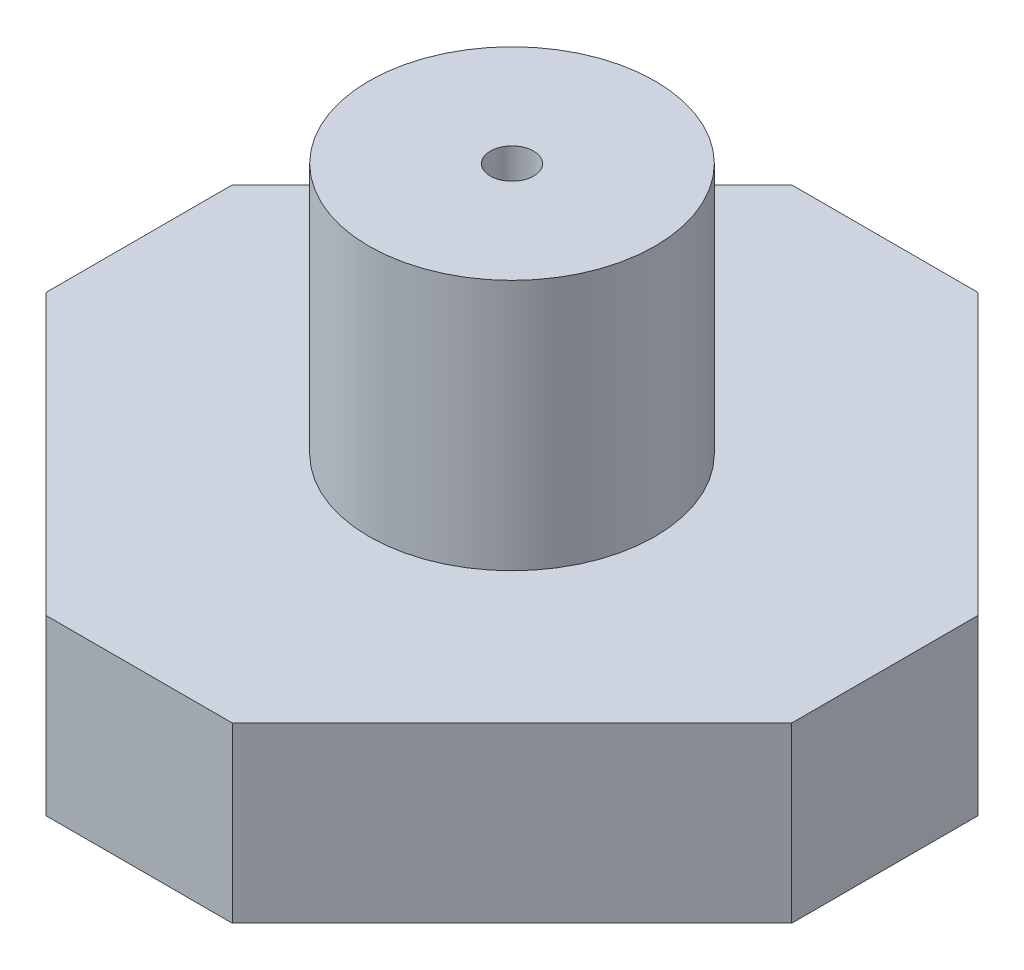
ISO-10303-21;
HEADER;
FILE_DESCRIPTION(('STEP AP214'),'2;1');
FILE_NAME('part.step','',(''),(''),'','','');
FILE_SCHEMA(('AUTOMOTIVE_DESIGN { 1 0 10303 214 1 1 1 1 }'));
ENDSEC;
DATA;
#1=APPLICATION_CONTEXT('core data for automotive mechanical design processes');
#2=APPLICATION_PROTOCOL_DEFINITION('international standard','automotive_design',2000,#1);
#3=PRODUCT_CONTEXT('',#1,'mechanical');
#4=PRODUCT('Part','Part','',(#3));
#5=PRODUCT_RELATED_PRODUCT_CATEGORY('part','',(#4));
#6=PRODUCT_DEFINITION_FORMATION('','',#4);
#7=PRODUCT_DEFINITION_CONTEXT('part definition',#1,'design');
#8=PRODUCT_DEFINITION('design','',#6,#7);
#9=PRODUCT_DEFINITION_SHAPE('','',#8);
#10=(LENGTH_UNIT() NAMED_UNIT(*) SI_UNIT(.MILLI.,.METRE.));
#11=(NAMED_UNIT(*) PLANE_ANGLE_UNIT() SI_UNIT($,.RADIAN.));
#12=(NAMED_UNIT(*) SI_UNIT($,.STERADIAN.) SOLID_ANGLE_UNIT());
#13=UNCERTAINTY_MEASURE_WITH_UNIT(LENGTH_MEASURE(1.E-05),#10,'distance_accuracy_value','');
#14=(GEOMETRIC_REPRESENTATION_CONTEXT(3) GLOBAL_UNCERTAINTY_ASSIGNED_CONTEXT((#13)) GLOBAL_UNIT_ASSIGNED_CONTEXT((#10,
#11,#12)) REPRESENTATION_CONTEXT('',''));
#15=CARTESIAN_POINT('',(0.,0.,0.));
#16=DIRECTION('',(0.,0.,1.));
#17=DIRECTION('',(1.,0.,0.));
#18=AXIS2_PLACEMENT_3D('',#15,#16,#17);
#19=CARTESIAN_POINT('',(-4.3,2.,-1.07401153701776));
#20=DIRECTION('',(1.,0.,0.));
#21=DIRECTION('',(0.,0.,-1.));
#22=AXIS2_PLACEMENT_3D('',#19,#20,#21);
#23=PLANE('',#22);
#24=DIRECTION('',(0.,0.,1.));
#25=VECTOR('',#24,1.);
#26=CARTESIAN_POINT('',(-4.3,0.,-1.07401153701776));
#27=LINE('',#26,#25);
#28=CARTESIAN_POINT('',(-4.3,0.,-1.07401153701776));
#29=VERTEX_POINT('',#28);
#30=CARTESIAN_POINT('',(-4.3,0.,1.07401153701776));
#31=VERTEX_POINT('',#30);
#32=EDGE_CURVE('E140',#29,#31,#27,.T.);
#33=ORIENTED_EDGE('',*,*,#32,.T.);
#34=DIRECTION('',(0.,-1.,0.));
#35=VECTOR('',#34,1.);
#36=CARTESIAN_POINT('',(-4.3,2.,1.07401153701776));
#37=LINE('',#36,#35);
#38=CARTESIAN_POINT('',(-4.3,2.,1.07401153701776));
#39=VERTEX_POINT('',#38);
#40=EDGE_CURVE('E50',#39,#31,#37,.T.);
#41=ORIENTED_EDGE('',*,*,#40,.F.);
#42=DIRECTION('',(0.,0.,1.));
#43=VECTOR('',#42,1.);
#44=CARTESIAN_POINT('',(-4.3,2.,-1.07401153701776));
#45=LINE('',#44,#43);
#46=CARTESIAN_POINT('',(-4.3,2.,-1.07401153701776));
#47=VERTEX_POINT('',#46);
#48=EDGE_CURVE('E155',#47,#39,#45,.T.);
#49=ORIENTED_EDGE('',*,*,#48,.F.);
#50=DIRECTION('',(0.,-1.,0.));
#51=VECTOR('',#50,1.);
#52=CARTESIAN_POINT('',(-4.3,2.,-1.07401153701776));
#53=LINE('',#52,#51);
#54=EDGE_CURVE('E136',#47,#29,#53,.T.);
#55=ORIENTED_EDGE('',*,*,#54,.T.);
#56=EDGE_LOOP('',(#33,#41,#49,#55));
#57=FACE_BOUND('',#56,.T.);
#58=ADVANCED_FACE('F41',(#57),#23,.F.);
#59=CARTESIAN_POINT('',(-4.3,2.,1.07401153701776));
#60=DIRECTION('',(0.707106781186548,0.,-0.707106781186547));
#61=DIRECTION('',(-0.707106781186547,0.,-0.707106781186548));
#62=AXIS2_PLACEMENT_3D('',#59,#60,#61);
#63=PLANE('',#62);
#64=DIRECTION('',(0.707106781186547,0.,0.707106781186548));
#65=VECTOR('',#64,1.);
#66=CARTESIAN_POINT('',(-4.3,0.,1.07401153701776));
#67=LINE('',#66,#65);
#68=CARTESIAN_POINT('',(-1.07401153701776,0.,4.3));
#69=VERTEX_POINT('',#68);
#70=EDGE_CURVE('E143',#31,#69,#67,.T.);
#71=ORIENTED_EDGE('',*,*,#70,.T.);
#72=DIRECTION('',(0.,-1.,0.));
#73=VECTOR('',#72,1.);
#74=CARTESIAN_POINT('',(-1.07401153701776,2.,4.3));
#75=LINE('',#74,#73);
#76=CARTESIAN_POINT('',(-1.07401153701776,2.,4.3));
#77=VERTEX_POINT('',#76);
#78=EDGE_CURVE('E165',#77,#69,#75,.T.);
#79=ORIENTED_EDGE('',*,*,#78,.F.);
#80=DIRECTION('',(0.707106781186547,0.,0.707106781186548));
#81=VECTOR('',#80,1.);
#82=CARTESIAN_POINT('',(-4.3,2.,1.07401153701776));
#83=LINE('',#82,#81);
#84=EDGE_CURVE('E103',#39,#77,#83,.T.);
#85=ORIENTED_EDGE('',*,*,#84,.F.);
#86=ORIENTED_EDGE('',*,*,#40,.T.);
#87=EDGE_LOOP('',(#71,#79,#85,#86));
#88=FACE_BOUND('',#87,.T.);
#89=ADVANCED_FACE('F168',(#88),#63,.F.);
#90=CARTESIAN_POINT('',(-1.07401153701776,2.,4.3));
#91=DIRECTION('',(0.,0.,-1.));
#92=DIRECTION('',(-1.,0.,0.));
#93=AXIS2_PLACEMENT_3D('',#90,#91,#92);
#94=PLANE('',#93);
#95=DIRECTION('',(1.,0.,0.));
#96=VECTOR('',#95,1.);
#97=CARTESIAN_POINT('',(-1.07401153701776,0.,4.3));
#98=LINE('',#97,#96);
#99=CARTESIAN_POINT('',(1.07401153701776,0.,4.3));
#100=VERTEX_POINT('',#99);
#101=EDGE_CURVE('E146',#69,#100,#98,.T.);
#102=ORIENTED_EDGE('',*,*,#101,.T.);
#103=DIRECTION('',(0.,-1.,0.));
#104=VECTOR('',#103,1.);
#105=CARTESIAN_POINT('',(1.07401153701776,2.,4.3));
#106=LINE('',#105,#104);
#107=CARTESIAN_POINT('',(1.07401153701776,2.,4.3));
#108=VERTEX_POINT('',#107);
#109=EDGE_CURVE('E162',#108,#100,#106,.T.);
#110=ORIENTED_EDGE('',*,*,#109,.F.);
#111=DIRECTION('',(1.,0.,0.));
#112=VECTOR('',#111,1.);
#113=CARTESIAN_POINT('',(-1.07401153701776,2.,4.3));
#114=LINE('',#113,#112);
#115=EDGE_CURVE('E186',#77,#108,#114,.T.);
#116=ORIENTED_EDGE('',*,*,#115,.F.);
#117=ORIENTED_EDGE('',*,*,#78,.T.);
#118=EDGE_LOOP('',(#102,#110,#116,#117));
#119=FACE_BOUND('',#118,.T.);
#120=ADVANCED_FACE('F179',(#119),#94,.F.);
#121=CARTESIAN_POINT('',(1.07401153701776,2.,4.3));
#122=DIRECTION('',(-0.707106781186548,0.,-0.707106781186547));
#123=DIRECTION('',(-0.707106781186547,0.,0.707106781186548));
#124=AXIS2_PLACEMENT_3D('',#121,#122,#123);
#125=PLANE('',#124);
#126=DIRECTION('',(0.707106781186547,0.,-0.707106781186548));
#127=VECTOR('',#126,1.);
#128=CARTESIAN_POINT('',(1.07401153701776,0.,4.3));
#129=LINE('',#128,#127);
#130=CARTESIAN_POINT('',(4.3,0.,1.07401153701776));
#131=VERTEX_POINT('',#130);
#132=EDGE_CURVE('E148',#100,#131,#129,.T.);
#133=ORIENTED_EDGE('',*,*,#132,.T.);
#134=DIRECTION('',(0.,-1.,0.));
#135=VECTOR('',#134,1.);
#136=CARTESIAN_POINT('',(4.3,2.,1.07401153701776));
#137=LINE('',#136,#135);
#138=CARTESIAN_POINT('',(4.3,2.,1.07401153701776));
#139=VERTEX_POINT('',#138);
#140=EDGE_CURVE('E159',#139,#131,#137,.T.);
#141=ORIENTED_EDGE('',*,*,#140,.F.);
#142=DIRECTION('',(0.707106781186547,0.,-0.707106781186548));
#143=VECTOR('',#142,1.);
#144=CARTESIAN_POINT('',(1.07401153701776,2.,4.3));
#145=LINE('',#144,#143);
#146=EDGE_CURVE('E185',#108,#139,#145,.T.);
#147=ORIENTED_EDGE('',*,*,#146,.F.);
#148=ORIENTED_EDGE('',*,*,#109,.T.);
#149=EDGE_LOOP('',(#133,#141,#147,#148));
#150=FACE_BOUND('',#149,.T.);
#151=ADVANCED_FACE('F183',(#150),#125,.F.);
#152=CARTESIAN_POINT('',(4.3,2.,-1.07401153701776));
#153=DIRECTION('',(-1.,0.,0.));
#154=DIRECTION('',(0.,0.,1.));
#155=AXIS2_PLACEMENT_3D('',#152,#153,#154);
#156=PLANE('',#155);
#157=DIRECTION('',(0.,0.,-1.));
#158=VECTOR('',#157,1.);
#159=CARTESIAN_POINT('',(4.3,0.,-1.07401153701776));
#160=LINE('',#159,#158);
#161=CARTESIAN_POINT('',(4.3,0.,-1.07401153701776));
#162=VERTEX_POINT('',#161);
#163=EDGE_CURVE('E150',#131,#162,#160,.T.);
#164=ORIENTED_EDGE('',*,*,#163,.T.);
#165=DIRECTION('',(0.,-1.,0.));
#166=VECTOR('',#165,1.);
#167=CARTESIAN_POINT('',(4.3,2.,-1.07401153701776));
#168=LINE('',#167,#166);
#169=CARTESIAN_POINT('',(4.3,2.,-1.07401153701776));
#170=VERTEX_POINT('',#169);
#171=EDGE_CURVE('E131',#170,#162,#168,.T.);
#172=ORIENTED_EDGE('',*,*,#171,.F.);
#173=DIRECTION('',(0.,0.,-1.));
#174=VECTOR('',#173,1.);
#175=CARTESIAN_POINT('',(4.3,2.,-1.07401153701776));
#176=LINE('',#175,#174);
#177=EDGE_CURVE('E122',#139,#170,#176,.T.);
#178=ORIENTED_EDGE('',*,*,#177,.F.);
#179=ORIENTED_EDGE('',*,*,#140,.T.);
#180=EDGE_LOOP('',(#164,#172,#178,#179));
#181=FACE_BOUND('',#180,.T.);
#182=ADVANCED_FACE('F236',(#181),#156,.F.);
#183=CARTESIAN_POINT('',(1.07401153701776,2.,-4.3));
#184=DIRECTION('',(-0.707106781186547,0.,0.707106781186548));
#185=DIRECTION('',(0.707106781186548,0.,0.707106781186547));
#186=AXIS2_PLACEMENT_3D('',#183,#184,#185);
#187=PLANE('',#186);
#188=DIRECTION('',(-0.707106781186548,0.,-0.707106781186547));
#189=VECTOR('',#188,1.);
#190=CARTESIAN_POINT('',(1.07401153701776,0.,-4.3));
#191=LINE('',#190,#189);
#192=CARTESIAN_POINT('',(1.07401153701776,0.,-4.3));
#193=VERTEX_POINT('',#192);
#194=EDGE_CURVE('E130',#162,#193,#191,.T.);
#195=ORIENTED_EDGE('',*,*,#194,.T.);
#196=DIRECTION('',(0.,-1.,0.));
#197=VECTOR('',#196,1.);
#198=CARTESIAN_POINT('',(1.07401153701776,2.,-4.3));
#199=LINE('',#198,#197);
#200=CARTESIAN_POINT('',(1.07401153701776,2.,-4.3));
#201=VERTEX_POINT('',#200);
#202=EDGE_CURVE('E127',#201,#193,#199,.T.);
#203=ORIENTED_EDGE('',*,*,#202,.F.);
#204=DIRECTION('',(-0.707106781186548,0.,-0.707106781186547));
#205=VECTOR('',#204,1.);
#206=CARTESIAN_POINT('',(1.07401153701776,2.,-4.3));
#207=LINE('',#206,#205);
#208=EDGE_CURVE('E116',#170,#201,#207,.T.);
#209=ORIENTED_EDGE('',*,*,#208,.F.);
#210=ORIENTED_EDGE('',*,*,#171,.T.);
#211=EDGE_LOOP('',(#195,#203,#209,#210));
#212=FACE_BOUND('',#211,.T.);
#213=ADVANCED_FACE('F128',(#212),#187,.F.);
#214=CARTESIAN_POINT('',(-1.07401153701776,2.,-4.3));
#215=DIRECTION('',(0.,0.,1.));
#216=DIRECTION('',(1.,0.,0.));
#217=AXIS2_PLACEMENT_3D('',#214,#215,#216);
#218=PLANE('',#217);
#219=DIRECTION('',(-1.,0.,0.));
#220=VECTOR('',#219,1.);
#221=CARTESIAN_POINT('',(-1.07401153701776,0.,-4.3));
#222=LINE('',#221,#220);
#223=CARTESIAN_POINT('',(-1.07401153701776,0.,-4.3));
#224=VERTEX_POINT('',#223);
#225=EDGE_CURVE('E88',#193,#224,#222,.T.);
#226=ORIENTED_EDGE('',*,*,#225,.T.);
#227=DIRECTION('',(0.,-1.,0.));
#228=VECTOR('',#227,1.);
#229=CARTESIAN_POINT('',(-1.07401153701776,2.,-4.3));
#230=LINE('',#229,#228);
#231=CARTESIAN_POINT('',(-1.07401153701776,2.,-4.3));
#232=VERTEX_POINT('',#231);
#233=EDGE_CURVE('E132',#232,#224,#230,.T.);
#234=ORIENTED_EDGE('',*,*,#233,.F.);
#235=DIRECTION('',(-1.,0.,0.));
#236=VECTOR('',#235,1.);
#237=CARTESIAN_POINT('',(-1.07401153701776,2.,-4.3));
#238=LINE('',#237,#236);
#239=EDGE_CURVE('E120',#201,#232,#238,.T.);
#240=ORIENTED_EDGE('',*,*,#239,.F.);
#241=ORIENTED_EDGE('',*,*,#202,.T.);
#242=EDGE_LOOP('',(#226,#234,#240,#241));
#243=FACE_BOUND('',#242,.T.);
#244=ADVANCED_FACE('F134',(#243),#218,.F.);
#245=CARTESIAN_POINT('',(-4.3,2.,-1.07401153701776));
#246=DIRECTION('',(0.707106781186547,0.,0.707106781186547));
#247=DIRECTION('',(0.707106781186548,0.,-0.707106781186548));
#248=AXIS2_PLACEMENT_3D('',#245,#246,#247);
#249=PLANE('',#248);
#250=DIRECTION('',(-0.707106781186548,0.,0.707106781186548));
#251=VECTOR('',#250,1.);
#252=CARTESIAN_POINT('',(-4.3,0.,-1.07401153701776));
#253=LINE('',#252,#251);
#254=EDGE_CURVE('E94',#224,#29,#253,.T.);
#255=ORIENTED_EDGE('',*,*,#254,.T.);
#256=ORIENTED_EDGE('',*,*,#54,.F.);
#257=DIRECTION('',(-0.707106781186548,0.,0.707106781186548));
#258=VECTOR('',#257,1.);
#259=CARTESIAN_POINT('',(-4.3,2.,-1.07401153701776));
#260=LINE('',#259,#258);
#261=EDGE_CURVE('E59',#232,#47,#260,.T.);
#262=ORIENTED_EDGE('',*,*,#261,.F.);
#263=ORIENTED_EDGE('',*,*,#233,.T.);
#264=EDGE_LOOP('',(#255,#256,#262,#263));
#265=FACE_BOUND('',#264,.T.);
#266=ADVANCED_FACE('F216',(#265),#249,.F.);
#267=CARTESIAN_POINT('',(0.,2.,0.));
#268=DIRECTION('',(0.,1.,0.));
#269=DIRECTION('',(0.,0.,1.));
#270=AXIS2_PLACEMENT_3D('',#267,#268,#269);
#271=PLANE('',#270);
#272=CARTESIAN_POINT('',(0.,2.,0.));
#273=DIRECTION('',(0.,1.,0.));
#274=DIRECTION('',(0.,0.,1.));
#275=AXIS2_PLACEMENT_3D('',#272,#273,#274);
#276=CIRCLE('',#275,1.65);
#277=CARTESIAN_POINT('',(0.,2.,1.65));
#278=VERTEX_POINT('',#277);
#279=EDGE_CURVE('E11',#278,#278,#276,.T.);
#280=ORIENTED_EDGE('',*,*,#279,.F.);
#281=EDGE_LOOP('',(#280));
#282=FACE_BOUND('',#281,.T.);
#283=ORIENTED_EDGE('',*,*,#48,.T.);
#284=ORIENTED_EDGE('',*,*,#84,.T.);
#285=ORIENTED_EDGE('',*,*,#115,.T.);
#286=ORIENTED_EDGE('',*,*,#146,.T.);
#287=ORIENTED_EDGE('',*,*,#177,.T.);
#288=ORIENTED_EDGE('',*,*,#208,.T.);
#289=ORIENTED_EDGE('',*,*,#239,.T.);
#290=ORIENTED_EDGE('',*,*,#261,.T.);
#291=EDGE_LOOP('',(#283,#284,#285,#286,#287,#288,#289,#290));
#292=FACE_BOUND('',#291,.T.);
#293=ADVANCED_FACE('F118',(#282,#292),#271,.T.);
#294=CARTESIAN_POINT('',(0.,0.,0.));
#295=DIRECTION('',(0.,1.,0.));
#296=DIRECTION('',(0.,0.,1.));
#297=AXIS2_PLACEMENT_3D('',#294,#295,#296);
#298=PLANE('',#297);
#299=CARTESIAN_POINT('',(0.,0.,0.));
#300=DIRECTION('',(0.,-1.,0.));
#301=DIRECTION('',(0.,0.,-1.));
#302=AXIS2_PLACEMENT_3D('',#299,#300,#301);
#303=CIRCLE('',#302,0.25);
#304=CARTESIAN_POINT('',(0.,0.,-0.25));
#305=VERTEX_POINT('',#304);
#306=EDGE_CURVE('E194',#305,#305,#303,.T.);
#307=ORIENTED_EDGE('',*,*,#306,.F.);
#308=EDGE_LOOP('',(#307));
#309=FACE_BOUND('',#308,.T.);
#310=ORIENTED_EDGE('',*,*,#32,.F.);
#311=ORIENTED_EDGE('',*,*,#254,.F.);
#312=ORIENTED_EDGE('',*,*,#225,.F.);
#313=ORIENTED_EDGE('',*,*,#194,.F.);
#314=ORIENTED_EDGE('',*,*,#163,.F.);
#315=ORIENTED_EDGE('',*,*,#132,.F.);
#316=ORIENTED_EDGE('',*,*,#101,.F.);
#317=ORIENTED_EDGE('',*,*,#70,.F.);
#318=EDGE_LOOP('',(#310,#311,#312,#313,#314,#315,#316,#317));
#319=FACE_BOUND('',#318,.T.);
#320=ADVANCED_FACE('F173',(#309,#319),#298,.F.);
#321=CARTESIAN_POINT('',(0.,4.9,0.));
#322=DIRECTION('',(0.,-1.,0.));
#323=DIRECTION('',(0.,0.,-1.));
#324=AXIS2_PLACEMENT_3D('',#321,#322,#323);
#325=CYLINDRICAL_SURFACE('',#324,1.65);
#326=CARTESIAN_POINT('',(0.,4.9,0.));
#327=DIRECTION('',(0.,1.,0.));
#328=DIRECTION('',(0.,0.,1.));
#329=AXIS2_PLACEMENT_3D('',#326,#327,#328);
#330=CIRCLE('',#329,1.65);
#331=CARTESIAN_POINT('',(0.,4.9,1.65));
#332=VERTEX_POINT('',#331);
#333=EDGE_CURVE('E144',#332,#332,#330,.T.);
#334=ORIENTED_EDGE('',*,*,#333,.F.);
#335=EDGE_LOOP('',(#334));
#336=FACE_BOUND('',#335,.T.);
#337=ORIENTED_EDGE('',*,*,#279,.T.);
#338=EDGE_LOOP('',(#337));
#339=FACE_BOUND('',#338,.T.);
#340=ADVANCED_FACE('F206',(#336,#339),#325,.T.);
#341=CARTESIAN_POINT('',(0.,4.9,0.));
#342=DIRECTION('',(0.,1.,0.));
#343=DIRECTION('',(0.,0.,1.));
#344=AXIS2_PLACEMENT_3D('',#341,#342,#343);
#345=PLANE('',#344);
#346=CARTESIAN_POINT('',(0.,4.9,0.));
#347=DIRECTION('',(0.,1.,0.));
#348=DIRECTION('',(0.,0.,1.));
#349=AXIS2_PLACEMENT_3D('',#346,#347,#348);
#350=CIRCLE('',#349,0.25);
#351=CARTESIAN_POINT('',(0.,4.9,0.25));
#352=VERTEX_POINT('',#351);
#353=EDGE_CURVE('E44',#352,#352,#350,.T.);
#354=ORIENTED_EDGE('',*,*,#353,.F.);
#355=EDGE_LOOP('',(#354));
#356=FACE_BOUND('',#355,.T.);
#357=ORIENTED_EDGE('',*,*,#333,.T.);
#358=EDGE_LOOP('',(#357));
#359=FACE_BOUND('',#358,.T.);
#360=ADVANCED_FACE('F203',(#356,#359),#345,.T.);
#361=CARTESIAN_POINT('',(0.,10.,0.));
#362=DIRECTION('',(0.,-1.,0.));
#363=DIRECTION('',(0.,0.,-1.));
#364=AXIS2_PLACEMENT_3D('',#361,#362,#363);
#365=CYLINDRICAL_SURFACE('',#364,0.25);
#366=ORIENTED_EDGE('',*,*,#353,.T.);
#367=EDGE_LOOP('',(#366));
#368=FACE_BOUND('',#367,.T.);
#369=ORIENTED_EDGE('',*,*,#306,.T.);
#370=EDGE_LOOP('',(#369));
#371=FACE_BOUND('',#370,.T.);
#372=ADVANCED_FACE('F201',(#368,#371),#365,.F.);
#373=CLOSED_SHELL('',(#58,#89,#120,#151,#182,#213,#244,#266,#293,#320,#340,#360,#372));
#374=MANIFOLD_SOLID_BREP('B2',#373);
#375=ADVANCED_BREP_SHAPE_REPRESENTATION('',(#18,#374),#14);
#376=SHAPE_DEFINITION_REPRESENTATION(#9,#375);
ENDSEC;
END-ISO-10303-21;
